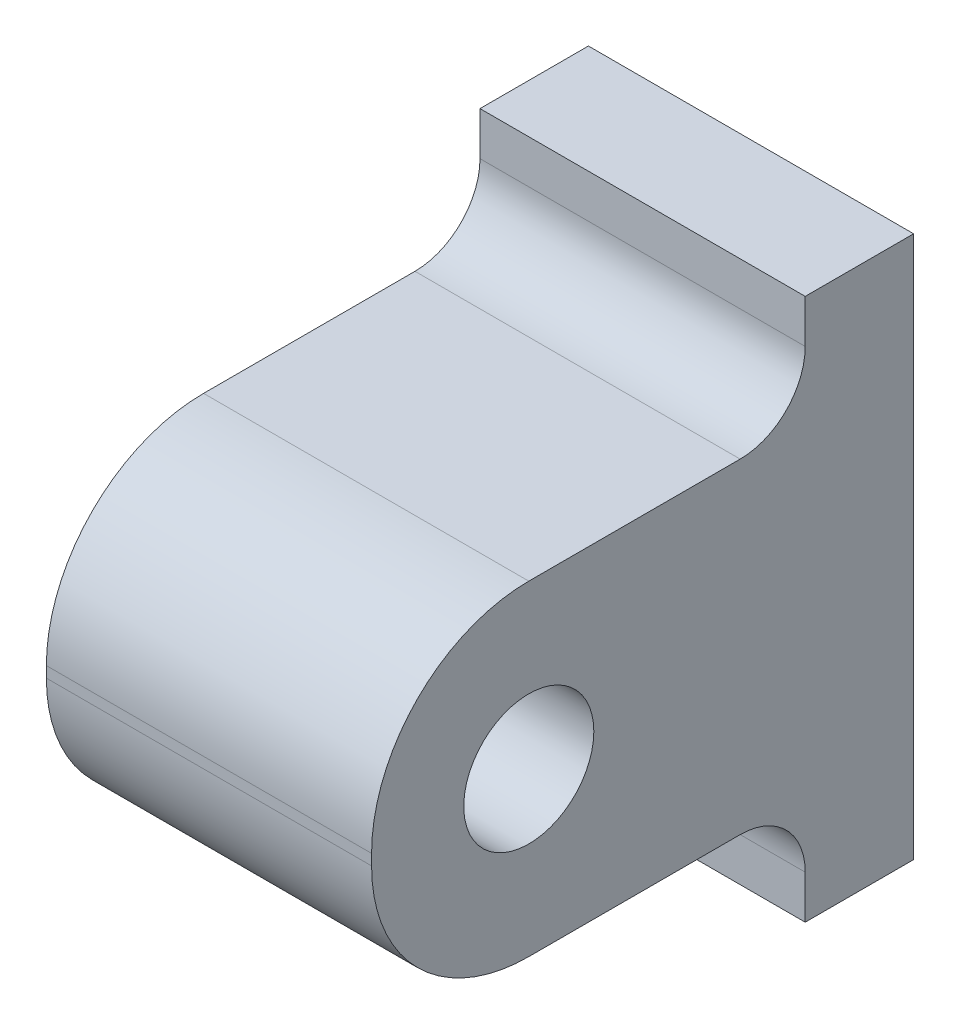
ISO-10303-21;
HEADER;
FILE_DESCRIPTION(('STEP AP214'),'2;1');
FILE_NAME('part.step','',(''),(''),'','','');
FILE_SCHEMA(('AUTOMOTIVE_DESIGN { 1 0 10303 214 1 1 1 1 }'));
ENDSEC;
DATA;
#1=APPLICATION_CONTEXT('core data for automotive mechanical design processes');
#2=APPLICATION_PROTOCOL_DEFINITION('international standard','automotive_design',2000,#1);
#3=PRODUCT_CONTEXT('',#1,'mechanical');
#4=PRODUCT('Part','Part','',(#3));
#5=PRODUCT_RELATED_PRODUCT_CATEGORY('part','',(#4));
#6=PRODUCT_DEFINITION_FORMATION('','',#4);
#7=PRODUCT_DEFINITION_CONTEXT('part definition',#1,'design');
#8=PRODUCT_DEFINITION('design','',#6,#7);
#9=PRODUCT_DEFINITION_SHAPE('','',#8);
#10=(LENGTH_UNIT() NAMED_UNIT(*) SI_UNIT(.MILLI.,.METRE.));
#11=(NAMED_UNIT(*) PLANE_ANGLE_UNIT() SI_UNIT($,.RADIAN.));
#12=(NAMED_UNIT(*) SI_UNIT($,.STERADIAN.) SOLID_ANGLE_UNIT());
#13=UNCERTAINTY_MEASURE_WITH_UNIT(LENGTH_MEASURE(1.E-05),#10,'distance_accuracy_value','');
#14=(GEOMETRIC_REPRESENTATION_CONTEXT(3) GLOBAL_UNCERTAINTY_ASSIGNED_CONTEXT((#13)) GLOBAL_UNIT_ASSIGNED_CONTEXT((#10,
#11,#12)) REPRESENTATION_CONTEXT('',''));
#15=CARTESIAN_POINT('',(0.,0.,0.));
#16=DIRECTION('',(0.,0.,1.));
#17=DIRECTION('',(1.,0.,0.));
#18=AXIS2_PLACEMENT_3D('',#15,#16,#17);
#19=CARTESIAN_POINT('',(-30.,-47.3350131653063,-42.2488312290685));
#20=DIRECTION('',(0.,-1.,0.));
#21=DIRECTION('',(0.,0.,-1.));
#22=AXIS2_PLACEMENT_3D('',#19,#20,#21);
#23=PLANE('',#22);
#24=DIRECTION('',(0.,0.,-1.));
#25=VECTOR('',#24,1.);
#26=CARTESIAN_POINT('',(0.,-47.3350131653063,-42.2488312290685));
#27=LINE('',#26,#25);
#28=CARTESIAN_POINT('',(0.,-47.3350131653063,-32.2488312290685));
#29=VERTEX_POINT('',#28);
#30=CARTESIAN_POINT('',(0.,-47.3350131653063,-42.2488312290685));
#31=VERTEX_POINT('',#30);
#32=EDGE_CURVE('E166',#29,#31,#27,.T.);
#33=ORIENTED_EDGE('',*,*,#32,.F.);
#34=DIRECTION('',(1.,0.,0.));
#35=VECTOR('',#34,1.);
#36=CARTESIAN_POINT('',(-30.,-47.3350131653063,-32.2488312290685));
#37=LINE('',#36,#35);
#38=CARTESIAN_POINT('',(-30.,-47.3350131653063,-32.2488312290685));
#39=VERTEX_POINT('',#38);
#40=EDGE_CURVE('E11',#39,#29,#37,.T.);
#41=ORIENTED_EDGE('',*,*,#40,.F.);
#42=DIRECTION('',(0.,0.,-1.));
#43=VECTOR('',#42,1.);
#44=CARTESIAN_POINT('',(-30.,-47.3350131653063,-42.2488312290685));
#45=LINE('',#44,#43);
#46=CARTESIAN_POINT('',(-30.,-47.3350131653063,-42.2488312290685));
#47=VERTEX_POINT('',#46);
#48=EDGE_CURVE('E199',#39,#47,#45,.T.);
#49=ORIENTED_EDGE('',*,*,#48,.T.);
#50=DIRECTION('',(1.,0.,0.));
#51=VECTOR('',#50,1.);
#52=CARTESIAN_POINT('',(-30.,-47.3350131653063,-42.2488312290685));
#53=LINE('',#52,#51);
#54=EDGE_CURVE('E48',#47,#31,#53,.T.);
#55=ORIENTED_EDGE('',*,*,#54,.T.);
#56=EDGE_LOOP('',(#33,#41,#49,#55));
#57=FACE_BOUND('',#56,.T.);
#58=ADVANCED_FACE('F45',(#57),#23,.T.);
#59=CARTESIAN_POINT('',(-30.,-47.3350131653063,-32.2488312290685));
#60=DIRECTION('',(0.,0.,1.));
#61=DIRECTION('',(1.,0.,0.));
#62=AXIS2_PLACEMENT_3D('',#59,#60,#61);
#63=PLANE('',#62);
#64=DIRECTION('',(0.,-1.,0.));
#65=VECTOR('',#64,1.);
#66=CARTESIAN_POINT('',(0.,-47.3350131653063,-32.2488312290685));
#67=LINE('',#66,#65);
#68=CARTESIAN_POINT('',(0.,-43.3350131653063,-32.2488312290685));
#69=VERTEX_POINT('',#68);
#70=EDGE_CURVE('E197',#69,#29,#67,.T.);
#71=ORIENTED_EDGE('',*,*,#70,.F.);
#72=DIRECTION('',(1.,0.,0.));
#73=VECTOR('',#72,1.);
#74=CARTESIAN_POINT('',(-30.,-43.3350131653063,-32.2488312290685));
#75=LINE('',#74,#73);
#76=CARTESIAN_POINT('',(-30.,-43.3350131653063,-32.2488312290685));
#77=VERTEX_POINT('',#76);
#78=EDGE_CURVE('E54',#77,#69,#75,.T.);
#79=ORIENTED_EDGE('',*,*,#78,.F.);
#80=DIRECTION('',(0.,-1.,0.));
#81=VECTOR('',#80,1.);
#82=CARTESIAN_POINT('',(-30.,-47.3350131653063,-32.2488312290685));
#83=LINE('',#82,#81);
#84=EDGE_CURVE('E156',#77,#39,#83,.T.);
#85=ORIENTED_EDGE('',*,*,#84,.T.);
#86=ORIENTED_EDGE('',*,*,#40,.T.);
#87=EDGE_LOOP('',(#71,#79,#85,#86));
#88=FACE_BOUND('',#87,.T.);
#89=ADVANCED_FACE('F219',(#88),#63,.T.);
#90=CARTESIAN_POINT('',(-30.,-43.3350131653062,-26.2488312290685));
#91=DIRECTION('',(1.,0.,0.));
#92=DIRECTION('',(0.,0.,-1.));
#93=AXIS2_PLACEMENT_3D('',#90,#91,#92);
#94=CYLINDRICAL_SURFACE('',#93,6.);
#95=CARTESIAN_POINT('',(0.,-43.3350131653062,-26.2488312290685));
#96=DIRECTION('',(-1.,0.,0.));
#97=DIRECTION('',(0.,0.,1.));
#98=AXIS2_PLACEMENT_3D('',#95,#96,#97);
#99=CIRCLE('',#98,6.);
#100=CARTESIAN_POINT('',(0.,-37.3350131653063,-26.2488312290684));
#101=VERTEX_POINT('',#100);
#102=EDGE_CURVE('E143',#101,#69,#99,.T.);
#103=ORIENTED_EDGE('',*,*,#102,.F.);
#104=DIRECTION('',(1.,0.,0.));
#105=VECTOR('',#104,1.);
#106=CARTESIAN_POINT('',(-30.,-37.3350131653063,-26.2488312290684));
#107=LINE('',#106,#105);
#108=CARTESIAN_POINT('',(-30.,-37.3350131653063,-26.2488312290684));
#109=VERTEX_POINT('',#108);
#110=EDGE_CURVE('E138',#109,#101,#107,.T.);
#111=ORIENTED_EDGE('',*,*,#110,.F.);
#112=CARTESIAN_POINT('',(-30.,-43.3350131653062,-26.2488312290685));
#113=DIRECTION('',(-1.,0.,0.));
#114=DIRECTION('',(0.,0.,1.));
#115=AXIS2_PLACEMENT_3D('',#112,#113,#114);
#116=CIRCLE('',#115,6.);
#117=EDGE_CURVE('E141',#109,#77,#116,.T.);
#118=ORIENTED_EDGE('',*,*,#117,.T.);
#119=ORIENTED_EDGE('',*,*,#78,.T.);
#120=EDGE_LOOP('',(#103,#111,#118,#119));
#121=FACE_BOUND('',#120,.T.);
#122=ADVANCED_FACE('F140',(#121),#94,.F.);
#123=CARTESIAN_POINT('',(-30.,-37.3350131653063,-26.2488312290684));
#124=DIRECTION('',(0.,-1.,0.));
#125=DIRECTION('',(0.,0.,-1.));
#126=AXIS2_PLACEMENT_3D('',#123,#124,#125);
#127=PLANE('',#126);
#128=DIRECTION('',(0.,0.,-1.));
#129=VECTOR('',#128,1.);
#130=CARTESIAN_POINT('',(0.,-37.3350131653063,-26.2488312290684));
#131=LINE('',#130,#129);
#132=CARTESIAN_POINT('',(0.,-37.3350131653063,-6.74883122906857));
#133=VERTEX_POINT('',#132);
#134=EDGE_CURVE('E194',#133,#101,#131,.T.);
#135=ORIENTED_EDGE('',*,*,#134,.F.);
#136=DIRECTION('',(1.,0.,0.));
#137=VECTOR('',#136,1.);
#138=CARTESIAN_POINT('',(-30.,-37.3350131653063,-6.74883122906857));
#139=LINE('',#138,#137);
#140=CARTESIAN_POINT('',(-30.,-37.3350131653063,-6.74883122906857));
#141=VERTEX_POINT('',#140);
#142=EDGE_CURVE('E148',#141,#133,#139,.T.);
#143=ORIENTED_EDGE('',*,*,#142,.F.);
#144=DIRECTION('',(0.,0.,-1.));
#145=VECTOR('',#144,1.);
#146=CARTESIAN_POINT('',(-30.,-37.3350131653063,-26.2488312290684));
#147=LINE('',#146,#145);
#148=EDGE_CURVE('E154',#141,#109,#147,.T.);
#149=ORIENTED_EDGE('',*,*,#148,.T.);
#150=ORIENTED_EDGE('',*,*,#110,.T.);
#151=EDGE_LOOP('',(#135,#143,#149,#150));
#152=FACE_BOUND('',#151,.T.);
#153=ADVANCED_FACE('F158',(#152),#127,.T.);
#154=CARTESIAN_POINT('',(-30.,-22.8350131653063,-6.74883122906847));
#155=DIRECTION('',(1.,0.,0.));
#156=DIRECTION('',(0.,0.,-1.));
#157=AXIS2_PLACEMENT_3D('',#154,#155,#156);
#158=CYLINDRICAL_SURFACE('',#157,14.5);
#159=CARTESIAN_POINT('',(0.,-22.8350131653063,-6.74883122906847));
#160=DIRECTION('',(1.,0.,0.));
#161=DIRECTION('',(0.,0.,-1.));
#162=AXIS2_PLACEMENT_3D('',#159,#160,#161);
#163=CIRCLE('',#162,14.5);
#164=CARTESIAN_POINT('',(0.,-22.8350131653062,7.75116877093153));
#165=VERTEX_POINT('',#164);
#166=EDGE_CURVE('E191',#165,#133,#163,.T.);
#167=ORIENTED_EDGE('',*,*,#166,.F.);
#168=DIRECTION('',(1.,0.,0.));
#169=VECTOR('',#168,1.);
#170=CARTESIAN_POINT('',(-30.,-22.8350131653062,7.75116877093153));
#171=LINE('',#170,#169);
#172=CARTESIAN_POINT('',(-30.,-22.8350131653062,7.75116877093153));
#173=VERTEX_POINT('',#172);
#174=EDGE_CURVE('E203',#173,#165,#171,.T.);
#175=ORIENTED_EDGE('',*,*,#174,.F.);
#176=CARTESIAN_POINT('',(-30.,-22.8350131653063,-6.74883122906847));
#177=DIRECTION('',(1.,0.,0.));
#178=DIRECTION('',(0.,0.,-1.));
#179=AXIS2_PLACEMENT_3D('',#176,#177,#178);
#180=CIRCLE('',#179,14.5);
#181=EDGE_CURVE('E159',#173,#141,#180,.T.);
#182=ORIENTED_EDGE('',*,*,#181,.T.);
#183=ORIENTED_EDGE('',*,*,#142,.T.);
#184=EDGE_LOOP('',(#167,#175,#182,#183));
#185=FACE_BOUND('',#184,.T.);
#186=ADVANCED_FACE('F232',(#185),#158,.T.);
#187=CARTESIAN_POINT('',(-30.,-22.8350131653062,7.75116877093153));
#188=DIRECTION('',(0.,0.,1.));
#189=DIRECTION('',(1.,0.,0.));
#190=AXIS2_PLACEMENT_3D('',#187,#188,#189);
#191=PLANE('',#190);
#192=DIRECTION('',(0.,-1.,0.));
#193=VECTOR('',#192,1.);
#194=CARTESIAN_POINT('',(0.,-22.8350131653062,7.75116877093153));
#195=LINE('',#194,#193);
#196=CARTESIAN_POINT('',(0.,-21.8350131653064,7.75116877093153));
#197=VERTEX_POINT('',#196);
#198=EDGE_CURVE('E188',#197,#165,#195,.T.);
#199=ORIENTED_EDGE('',*,*,#198,.F.);
#200=DIRECTION('',(1.,0.,0.));
#201=VECTOR('',#200,1.);
#202=CARTESIAN_POINT('',(-30.,-21.8350131653064,7.75116877093153));
#203=LINE('',#202,#201);
#204=CARTESIAN_POINT('',(-30.,-21.8350131653064,7.75116877093153));
#205=VERTEX_POINT('',#204);
#206=EDGE_CURVE('E205',#205,#197,#203,.T.);
#207=ORIENTED_EDGE('',*,*,#206,.F.);
#208=DIRECTION('',(0.,-1.,0.));
#209=VECTOR('',#208,1.);
#210=CARTESIAN_POINT('',(-30.,-22.8350131653062,7.75116877093153));
#211=LINE('',#210,#209);
#212=EDGE_CURVE('E161',#205,#173,#211,.T.);
#213=ORIENTED_EDGE('',*,*,#212,.T.);
#214=ORIENTED_EDGE('',*,*,#174,.T.);
#215=EDGE_LOOP('',(#199,#207,#213,#214));
#216=FACE_BOUND('',#215,.T.);
#217=ADVANCED_FACE('F235',(#216),#191,.T.);
#218=CARTESIAN_POINT('',(-30.,-21.8350131653062,-6.74883122906847));
#219=DIRECTION('',(1.,0.,0.));
#220=DIRECTION('',(0.,0.,-1.));
#221=AXIS2_PLACEMENT_3D('',#218,#219,#220);
#222=CYLINDRICAL_SURFACE('',#221,14.5);
#223=CARTESIAN_POINT('',(0.,-21.8350131653062,-6.74883122906847));
#224=DIRECTION('',(1.,0.,0.));
#225=DIRECTION('',(0.,0.,1.));
#226=AXIS2_PLACEMENT_3D('',#223,#224,#225);
#227=CIRCLE('',#226,14.5);
#228=CARTESIAN_POINT('',(0.,-7.33501316530625,-6.74883122906857));
#229=VERTEX_POINT('',#228);
#230=EDGE_CURVE('E185',#229,#197,#227,.T.);
#231=ORIENTED_EDGE('',*,*,#230,.F.);
#232=DIRECTION('',(1.,0.,0.));
#233=VECTOR('',#232,1.);
#234=CARTESIAN_POINT('',(-30.,-7.33501316530625,-6.74883122906857));
#235=LINE('',#234,#233);
#236=CARTESIAN_POINT('',(-30.,-7.33501316530625,-6.74883122906857));
#237=VERTEX_POINT('',#236);
#238=EDGE_CURVE('E207',#237,#229,#235,.T.);
#239=ORIENTED_EDGE('',*,*,#238,.F.);
#240=CARTESIAN_POINT('',(-30.,-21.8350131653062,-6.74883122906847));
#241=DIRECTION('',(1.,0.,0.));
#242=DIRECTION('',(0.,0.,1.));
#243=AXIS2_PLACEMENT_3D('',#240,#241,#242);
#244=CIRCLE('',#243,14.5);
#245=EDGE_CURVE('E298',#237,#205,#244,.T.);
#246=ORIENTED_EDGE('',*,*,#245,.T.);
#247=ORIENTED_EDGE('',*,*,#206,.T.);
#248=EDGE_LOOP('',(#231,#239,#246,#247));
#249=FACE_BOUND('',#248,.T.);
#250=ADVANCED_FACE('F239',(#249),#222,.T.);
#251=CARTESIAN_POINT('',(-30.,-7.33501316530625,-6.74883122906857));
#252=DIRECTION('',(0.,1.,0.));
#253=DIRECTION('',(0.,0.,1.));
#254=AXIS2_PLACEMENT_3D('',#251,#252,#253);
#255=PLANE('',#254);
#256=DIRECTION('',(0.,0.,1.));
#257=VECTOR('',#256,1.);
#258=CARTESIAN_POINT('',(0.,-7.33501316530625,-6.74883122906857));
#259=LINE('',#258,#257);
#260=CARTESIAN_POINT('',(0.,-7.33501316530625,-26.2488312290684));
#261=VERTEX_POINT('',#260);
#262=EDGE_CURVE('E182',#261,#229,#259,.T.);
#263=ORIENTED_EDGE('',*,*,#262,.F.);
#264=DIRECTION('',(1.,0.,0.));
#265=VECTOR('',#264,1.);
#266=CARTESIAN_POINT('',(-30.,-7.33501316530625,-26.2488312290684));
#267=LINE('',#266,#265);
#268=CARTESIAN_POINT('',(-30.,-7.33501316530625,-26.2488312290684));
#269=VERTEX_POINT('',#268);
#270=EDGE_CURVE('E209',#269,#261,#267,.T.);
#271=ORIENTED_EDGE('',*,*,#270,.F.);
#272=DIRECTION('',(0.,0.,1.));
#273=VECTOR('',#272,1.);
#274=CARTESIAN_POINT('',(-30.,-7.33501316530625,-6.74883122906857));
#275=LINE('',#274,#273);
#276=EDGE_CURVE('E295',#269,#237,#275,.T.);
#277=ORIENTED_EDGE('',*,*,#276,.T.);
#278=ORIENTED_EDGE('',*,*,#238,.T.);
#279=EDGE_LOOP('',(#263,#271,#277,#278));
#280=FACE_BOUND('',#279,.T.);
#281=ADVANCED_FACE('F243',(#280),#255,.T.);
#282=CARTESIAN_POINT('',(-30.,-1.33501316530625,-26.2488312290685));
#283=DIRECTION('',(1.,0.,0.));
#284=DIRECTION('',(0.,0.,-1.));
#285=AXIS2_PLACEMENT_3D('',#282,#283,#284);
#286=CYLINDRICAL_SURFACE('',#285,6.);
#287=CARTESIAN_POINT('',(0.,-1.33501316530625,-26.2488312290685));
#288=DIRECTION('',(-1.,0.,0.));
#289=DIRECTION('',(0.,0.,1.));
#290=AXIS2_PLACEMENT_3D('',#287,#288,#289);
#291=CIRCLE('',#290,6.);
#292=CARTESIAN_POINT('',(0.,-1.33501316530621,-32.2488312290685));
#293=VERTEX_POINT('',#292);
#294=EDGE_CURVE('E179',#293,#261,#291,.T.);
#295=ORIENTED_EDGE('',*,*,#294,.F.);
#296=DIRECTION('',(1.,0.,0.));
#297=VECTOR('',#296,1.);
#298=CARTESIAN_POINT('',(-30.,-1.33501316530621,-32.2488312290685));
#299=LINE('',#298,#297);
#300=CARTESIAN_POINT('',(-30.,-1.33501316530621,-32.2488312290685));
#301=VERTEX_POINT('',#300);
#302=EDGE_CURVE('E211',#301,#293,#299,.T.);
#303=ORIENTED_EDGE('',*,*,#302,.F.);
#304=CARTESIAN_POINT('',(-30.,-1.33501316530625,-26.2488312290685));
#305=DIRECTION('',(-1.,0.,0.));
#306=DIRECTION('',(0.,0.,1.));
#307=AXIS2_PLACEMENT_3D('',#304,#305,#306);
#308=CIRCLE('',#307,6.);
#309=EDGE_CURVE('E292',#301,#269,#308,.T.);
#310=ORIENTED_EDGE('',*,*,#309,.T.);
#311=ORIENTED_EDGE('',*,*,#270,.T.);
#312=EDGE_LOOP('',(#295,#303,#310,#311));
#313=FACE_BOUND('',#312,.T.);
#314=ADVANCED_FACE('F247',(#313),#286,.F.);
#315=CARTESIAN_POINT('',(-30.,2.66498683469375,-32.2488312290685));
#316=DIRECTION('',(0.,0.,1.));
#317=DIRECTION('',(1.,0.,0.));
#318=AXIS2_PLACEMENT_3D('',#315,#316,#317);
#319=PLANE('',#318);
#320=DIRECTION('',(0.,-1.,0.));
#321=VECTOR('',#320,1.);
#322=CARTESIAN_POINT('',(0.,2.66498683469375,-32.2488312290685));
#323=LINE('',#322,#321);
#324=CARTESIAN_POINT('',(0.,2.66498683469375,-32.2488312290685));
#325=VERTEX_POINT('',#324);
#326=EDGE_CURVE('E176',#325,#293,#323,.T.);
#327=ORIENTED_EDGE('',*,*,#326,.F.);
#328=DIRECTION('',(1.,0.,0.));
#329=VECTOR('',#328,1.);
#330=CARTESIAN_POINT('',(-30.,2.66498683469375,-32.2488312290685));
#331=LINE('',#330,#329);
#332=CARTESIAN_POINT('',(-30.,2.66498683469375,-32.2488312290685));
#333=VERTEX_POINT('',#332);
#334=EDGE_CURVE('E213',#333,#325,#331,.T.);
#335=ORIENTED_EDGE('',*,*,#334,.F.);
#336=DIRECTION('',(0.,-1.,0.));
#337=VECTOR('',#336,1.);
#338=CARTESIAN_POINT('',(-30.,2.66498683469375,-32.2488312290685));
#339=LINE('',#338,#337);
#340=EDGE_CURVE('E289',#333,#301,#339,.T.);
#341=ORIENTED_EDGE('',*,*,#340,.T.);
#342=ORIENTED_EDGE('',*,*,#302,.T.);
#343=EDGE_LOOP('',(#327,#335,#341,#342));
#344=FACE_BOUND('',#343,.T.);
#345=ADVANCED_FACE('F251',(#344),#319,.T.);
#346=CARTESIAN_POINT('',(-30.,2.66498683469375,-42.2488312290685));
#347=DIRECTION('',(0.,1.,0.));
#348=DIRECTION('',(0.,0.,1.));
#349=AXIS2_PLACEMENT_3D('',#346,#347,#348);
#350=PLANE('',#349);
#351=DIRECTION('',(0.,0.,1.));
#352=VECTOR('',#351,1.);
#353=CARTESIAN_POINT('',(0.,2.66498683469375,-42.2488312290685));
#354=LINE('',#353,#352);
#355=CARTESIAN_POINT('',(0.,2.66498683469375,-42.2488312290685));
#356=VERTEX_POINT('',#355);
#357=EDGE_CURVE('E173',#356,#325,#354,.T.);
#358=ORIENTED_EDGE('',*,*,#357,.F.);
#359=DIRECTION('',(1.,0.,0.));
#360=VECTOR('',#359,1.);
#361=CARTESIAN_POINT('',(-30.,2.66498683469375,-42.2488312290685));
#362=LINE('',#361,#360);
#363=CARTESIAN_POINT('',(-30.,2.66498683469375,-42.2488312290685));
#364=VERTEX_POINT('',#363);
#365=EDGE_CURVE('E214',#364,#356,#362,.T.);
#366=ORIENTED_EDGE('',*,*,#365,.F.);
#367=DIRECTION('',(0.,0.,1.));
#368=VECTOR('',#367,1.);
#369=CARTESIAN_POINT('',(-30.,2.66498683469375,-42.2488312290685));
#370=LINE('',#369,#368);
#371=EDGE_CURVE('E286',#364,#333,#370,.T.);
#372=ORIENTED_EDGE('',*,*,#371,.T.);
#373=ORIENTED_EDGE('',*,*,#334,.T.);
#374=EDGE_LOOP('',(#358,#366,#372,#373));
#375=FACE_BOUND('',#374,.T.);
#376=ADVANCED_FACE('F255',(#375),#350,.T.);
#377=CARTESIAN_POINT('',(-30.,-47.3350131653063,-42.2488312290685));
#378=DIRECTION('',(0.,0.,-1.));
#379=DIRECTION('',(-1.,0.,0.));
#380=AXIS2_PLACEMENT_3D('',#377,#378,#379);
#381=PLANE('',#380);
#382=DIRECTION('',(0.,1.,0.));
#383=VECTOR('',#382,1.);
#384=CARTESIAN_POINT('',(0.,-47.3350131653063,-42.2488312290685));
#385=LINE('',#384,#383);
#386=EDGE_CURVE('E169',#31,#356,#385,.T.);
#387=ORIENTED_EDGE('',*,*,#386,.F.);
#388=ORIENTED_EDGE('',*,*,#54,.F.);
#389=DIRECTION('',(0.,1.,0.));
#390=VECTOR('',#389,1.);
#391=CARTESIAN_POINT('',(-30.,-47.3350131653063,-42.2488312290685));
#392=LINE('',#391,#390);
#393=EDGE_CURVE('E284',#47,#364,#392,.T.);
#394=ORIENTED_EDGE('',*,*,#393,.T.);
#395=ORIENTED_EDGE('',*,*,#365,.T.);
#396=EDGE_LOOP('',(#387,#388,#394,#395));
#397=FACE_BOUND('',#396,.T.);
#398=ADVANCED_FACE('F216',(#397),#381,.T.);
#399=CARTESIAN_POINT('',(-30.,-43.3350131653062,-26.2488312290685));
#400=DIRECTION('',(-1.,0.,0.));
#401=DIRECTION('',(0.,0.,1.));
#402=AXIS2_PLACEMENT_3D('',#399,#400,#401);
#403=PLANE('',#402);
#404=CARTESIAN_POINT('',(-30.,-22.3350131653063,-6.74883122906847));
#405=DIRECTION('',(1.,0.,0.));
#406=DIRECTION('',(0.,0.,-1.));
#407=AXIS2_PLACEMENT_3D('',#404,#405,#406);
#408=CIRCLE('',#407,6.);
#409=CARTESIAN_POINT('',(-30.,-22.3350131653063,-12.7488312290685));
#410=VERTEX_POINT('',#409);
#411=EDGE_CURVE('E170',#410,#410,#408,.T.);
#412=ORIENTED_EDGE('',*,*,#411,.T.);
#413=EDGE_LOOP('',(#412));
#414=FACE_BOUND('',#413,.T.);
#415=ORIENTED_EDGE('',*,*,#48,.F.);
#416=ORIENTED_EDGE('',*,*,#84,.F.);
#417=ORIENTED_EDGE('',*,*,#117,.F.);
#418=ORIENTED_EDGE('',*,*,#148,.F.);
#419=ORIENTED_EDGE('',*,*,#181,.F.);
#420=ORIENTED_EDGE('',*,*,#212,.F.);
#421=ORIENTED_EDGE('',*,*,#245,.F.);
#422=ORIENTED_EDGE('',*,*,#276,.F.);
#423=ORIENTED_EDGE('',*,*,#309,.F.);
#424=ORIENTED_EDGE('',*,*,#340,.F.);
#425=ORIENTED_EDGE('',*,*,#371,.F.);
#426=ORIENTED_EDGE('',*,*,#393,.F.);
#427=EDGE_LOOP('',(#415,#416,#417,#418,#419,#420,#421,#422,#423,#424,#425,#426));
#428=FACE_BOUND('',#427,.T.);
#429=ADVANCED_FACE('F152',(#414,#428),#403,.T.);
#430=CARTESIAN_POINT('',(0.,-43.3350131653062,-26.2488312290685));
#431=DIRECTION('',(-1.,0.,0.));
#432=DIRECTION('',(0.,0.,1.));
#433=AXIS2_PLACEMENT_3D('',#430,#431,#432);
#434=PLANE('',#433);
#435=CARTESIAN_POINT('',(0.,-22.3350131653063,-6.74883122906847));
#436=DIRECTION('',(1.,0.,0.));
#437=DIRECTION('',(0.,0.,-1.));
#438=AXIS2_PLACEMENT_3D('',#435,#436,#437);
#439=CIRCLE('',#438,6.);
#440=CARTESIAN_POINT('',(0.,-22.3350131653063,-12.7488312290685));
#441=VERTEX_POINT('',#440);
#442=EDGE_CURVE('E279',#441,#441,#439,.T.);
#443=ORIENTED_EDGE('',*,*,#442,.F.);
#444=EDGE_LOOP('',(#443));
#445=FACE_BOUND('',#444,.T.);
#446=ORIENTED_EDGE('',*,*,#32,.T.);
#447=ORIENTED_EDGE('',*,*,#386,.T.);
#448=ORIENTED_EDGE('',*,*,#357,.T.);
#449=ORIENTED_EDGE('',*,*,#326,.T.);
#450=ORIENTED_EDGE('',*,*,#294,.T.);
#451=ORIENTED_EDGE('',*,*,#262,.T.);
#452=ORIENTED_EDGE('',*,*,#230,.T.);
#453=ORIENTED_EDGE('',*,*,#198,.T.);
#454=ORIENTED_EDGE('',*,*,#166,.T.);
#455=ORIENTED_EDGE('',*,*,#134,.T.);
#456=ORIENTED_EDGE('',*,*,#102,.T.);
#457=ORIENTED_EDGE('',*,*,#70,.T.);
#458=EDGE_LOOP('',(#446,#447,#448,#449,#450,#451,#452,#453,#454,#455,#456,#457));
#459=FACE_BOUND('',#458,.T.);
#460=ADVANCED_FACE('F218',(#445,#459),#434,.F.);
#461=CARTESIAN_POINT('',(-30.,-22.3350131653063,-6.74883122906847));
#462=DIRECTION('',(1.,0.,0.));
#463=DIRECTION('',(0.,0.,-1.));
#464=AXIS2_PLACEMENT_3D('',#461,#462,#463);
#465=CYLINDRICAL_SURFACE('',#464,6.);
#466=ORIENTED_EDGE('',*,*,#411,.F.);
#467=EDGE_LOOP('',(#466));
#468=FACE_BOUND('',#467,.T.);
#469=ORIENTED_EDGE('',*,*,#442,.T.);
#470=EDGE_LOOP('',(#469));
#471=FACE_BOUND('',#470,.T.);
#472=ADVANCED_FACE('F267',(#468,#471),#465,.F.);
#473=CLOSED_SHELL('',(#58,#89,#122,#153,#186,#217,#250,#281,#314,#345,#376,#398,#429,#460,#472));
#474=MANIFOLD_SOLID_BREP('B2',#473);
#475=ADVANCED_BREP_SHAPE_REPRESENTATION('',(#18,#474),#14);
#476=SHAPE_DEFINITION_REPRESENTATION(#9,#475);
ENDSEC;
END-ISO-10303-21;
